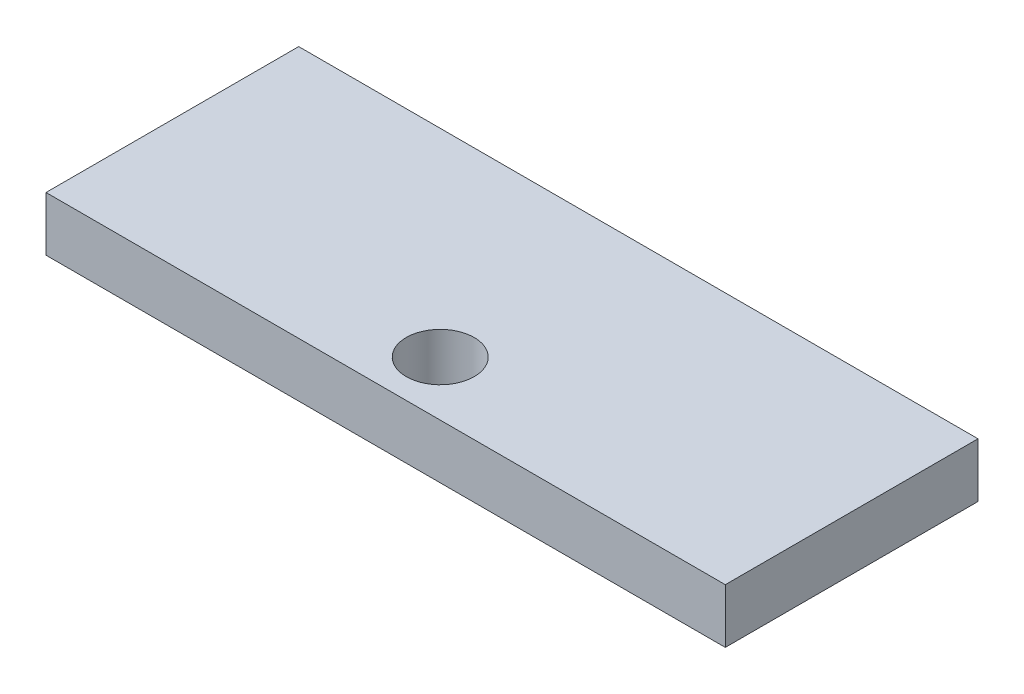
ISO-10303-21;
HEADER;
FILE_DESCRIPTION(('STEP AP214'),'2;1');
FILE_NAME('part.step','',(''),(''),'','','');
FILE_SCHEMA(('AUTOMOTIVE_DESIGN { 1 0 10303 214 1 1 1 1 }'));
ENDSEC;
DATA;
#1=APPLICATION_CONTEXT('core data for automotive mechanical design processes');
#2=APPLICATION_PROTOCOL_DEFINITION('international standard','automotive_design',2000,#1);
#3=PRODUCT_CONTEXT('',#1,'mechanical');
#4=PRODUCT('Part','Part','',(#3));
#5=PRODUCT_RELATED_PRODUCT_CATEGORY('part','',(#4));
#6=PRODUCT_DEFINITION_FORMATION('','',#4);
#7=PRODUCT_DEFINITION_CONTEXT('part definition',#1,'design');
#8=PRODUCT_DEFINITION('design','',#6,#7);
#9=PRODUCT_DEFINITION_SHAPE('','',#8);
#10=(LENGTH_UNIT() NAMED_UNIT(*) SI_UNIT(.MILLI.,.METRE.));
#11=(NAMED_UNIT(*) PLANE_ANGLE_UNIT() SI_UNIT($,.RADIAN.));
#12=(NAMED_UNIT(*) SI_UNIT($,.STERADIAN.) SOLID_ANGLE_UNIT());
#13=UNCERTAINTY_MEASURE_WITH_UNIT(LENGTH_MEASURE(1.E-05),#10,'distance_accuracy_value','');
#14=(GEOMETRIC_REPRESENTATION_CONTEXT(3) GLOBAL_UNCERTAINTY_ASSIGNED_CONTEXT((#13)) GLOBAL_UNIT_ASSIGNED_CONTEXT((#10,
#11,#12)) REPRESENTATION_CONTEXT('',''));
#15=CARTESIAN_POINT('',(0.,0.,0.));
#16=DIRECTION('',(0.,0.,1.));
#17=DIRECTION('',(1.,0.,0.));
#18=AXIS2_PLACEMENT_3D('',#15,#16,#17);
#19=CARTESIAN_POINT('',(0.,2.,0.));
#20=DIRECTION('',(0.,1.,0.));
#21=DIRECTION('',(0.,0.,1.));
#22=AXIS2_PLACEMENT_3D('',#19,#20,#21);
#23=PLANE('',#22);
#24=DIRECTION('',(0.,0.,-1.));
#25=VECTOR('',#24,1.);
#26=CARTESIAN_POINT('',(12.5,2.,4.75));
#27=LINE('',#26,#25);
#28=CARTESIAN_POINT('',(12.5,2.,4.75));
#29=VERTEX_POINT('',#28);
#30=CARTESIAN_POINT('',(12.5,2.,-4.55));
#31=VERTEX_POINT('',#30);
#32=EDGE_CURVE('E106',#29,#31,#27,.T.);
#33=ORIENTED_EDGE('',*,*,#32,.T.);
#34=DIRECTION('',(-1.,0.,0.));
#35=VECTOR('',#34,1.);
#36=CARTESIAN_POINT('',(-12.5,2.,-4.55));
#37=LINE('',#36,#35);
#38=CARTESIAN_POINT('',(-12.5,2.,-4.55));
#39=VERTEX_POINT('',#38);
#40=EDGE_CURVE('E11',#31,#39,#37,.T.);
#41=ORIENTED_EDGE('',*,*,#40,.T.);
#42=DIRECTION('',(0.,0.,1.));
#43=VECTOR('',#42,1.);
#44=CARTESIAN_POINT('',(-12.5,2.,4.75));
#45=LINE('',#44,#43);
#46=CARTESIAN_POINT('',(-12.5,2.,4.75));
#47=VERTEX_POINT('',#46);
#48=EDGE_CURVE('E88',#39,#47,#45,.T.);
#49=ORIENTED_EDGE('',*,*,#48,.T.);
#50=DIRECTION('',(1.,0.,0.));
#51=VECTOR('',#50,1.);
#52=CARTESIAN_POINT('',(12.5,2.,4.75));
#53=LINE('',#52,#51);
#54=EDGE_CURVE('E91',#47,#29,#53,.T.);
#55=ORIENTED_EDGE('',*,*,#54,.T.);
#56=EDGE_LOOP('',(#33,#41,#49,#55));
#57=FACE_BOUND('',#56,.T.);
#58=CARTESIAN_POINT('',(1.54390389361936E-13,2.,2.74151065336472));
#59=DIRECTION('',(0.,1.,0.));
#60=DIRECTION('',(0.,0.,1.));
#61=AXIS2_PLACEMENT_3D('',#58,#59,#60);
#62=CIRCLE('',#61,1.25);
#63=CARTESIAN_POINT('',(1.54390389361936E-13,2.,3.99151065336472));
#64=VERTEX_POINT('',#63);
#65=EDGE_CURVE('E142',#64,#64,#62,.T.);
#66=ORIENTED_EDGE('',*,*,#65,.F.);
#67=EDGE_LOOP('',(#66));
#68=FACE_BOUND('',#67,.T.);
#69=ADVANCED_FACE('F33',(#57,#68),#23,.T.);
#70=CARTESIAN_POINT('',(0.,0.,0.));
#71=DIRECTION('',(0.,1.,0.));
#72=DIRECTION('',(0.,0.,1.));
#73=AXIS2_PLACEMENT_3D('',#70,#71,#72);
#74=PLANE('',#73);
#75=DIRECTION('',(0.,0.,1.));
#76=VECTOR('',#75,1.);
#77=CARTESIAN_POINT('',(-12.5,0.,4.75));
#78=LINE('',#77,#76);
#79=CARTESIAN_POINT('',(-12.5,0.,-4.55));
#80=VERTEX_POINT('',#79);
#81=CARTESIAN_POINT('',(-12.5,0.,4.75));
#82=VERTEX_POINT('',#81);
#83=EDGE_CURVE('E109',#80,#82,#78,.T.);
#84=ORIENTED_EDGE('',*,*,#83,.F.);
#85=DIRECTION('',(1.,0.,0.));
#86=VECTOR('',#85,1.);
#87=CARTESIAN_POINT('',(0.,0.,-4.55));
#88=LINE('',#87,#86);
#89=CARTESIAN_POINT('',(12.5,0.,-4.55));
#90=VERTEX_POINT('',#89);
#91=EDGE_CURVE('E57',#80,#90,#88,.T.);
#92=ORIENTED_EDGE('',*,*,#91,.T.);
#93=DIRECTION('',(0.,0.,-1.));
#94=VECTOR('',#93,1.);
#95=CARTESIAN_POINT('',(12.5,0.,4.75));
#96=LINE('',#95,#94);
#97=CARTESIAN_POINT('',(12.5,0.,4.75));
#98=VERTEX_POINT('',#97);
#99=EDGE_CURVE('E98',#98,#90,#96,.T.);
#100=ORIENTED_EDGE('',*,*,#99,.F.);
#101=DIRECTION('',(1.,0.,0.));
#102=VECTOR('',#101,1.);
#103=CARTESIAN_POINT('',(12.5,0.,4.75));
#104=LINE('',#103,#102);
#105=EDGE_CURVE('E151',#82,#98,#104,.T.);
#106=ORIENTED_EDGE('',*,*,#105,.F.);
#107=EDGE_LOOP('',(#84,#92,#100,#106));
#108=FACE_BOUND('',#107,.T.);
#109=CARTESIAN_POINT('',(1.54390389361936E-13,0.,2.74151065336472));
#110=DIRECTION('',(0.,1.,0.));
#111=DIRECTION('',(0.,0.,1.));
#112=AXIS2_PLACEMENT_3D('',#109,#110,#111);
#113=CIRCLE('',#112,1.25);
#114=CARTESIAN_POINT('',(1.54390389361936E-13,0.,3.99151065336472));
#115=VERTEX_POINT('',#114);
#116=EDGE_CURVE('E137',#115,#115,#113,.T.);
#117=ORIENTED_EDGE('',*,*,#116,.T.);
#118=EDGE_LOOP('',(#117));
#119=FACE_BOUND('',#118,.T.);
#120=ADVANCED_FACE('F161',(#108,#119),#74,.F.);
#121=CARTESIAN_POINT('',(-12.5,2.,4.75));
#122=DIRECTION('',(1.,0.,0.));
#123=DIRECTION('',(0.,0.,-1.));
#124=AXIS2_PLACEMENT_3D('',#121,#122,#123);
#125=PLANE('',#124);
#126=ORIENTED_EDGE('',*,*,#48,.F.);
#127=DIRECTION('',(0.,-1.,0.));
#128=VECTOR('',#127,1.);
#129=CARTESIAN_POINT('',(-12.5,2.,-4.55));
#130=LINE('',#129,#128);
#131=EDGE_CURVE('E111',#39,#80,#130,.T.);
#132=ORIENTED_EDGE('',*,*,#131,.T.);
#133=ORIENTED_EDGE('',*,*,#83,.T.);
#134=DIRECTION('',(0.,-1.,0.));
#135=VECTOR('',#134,1.);
#136=CARTESIAN_POINT('',(-12.5,2.,4.75));
#137=LINE('',#136,#135);
#138=EDGE_CURVE('E103',#47,#82,#137,.T.);
#139=ORIENTED_EDGE('',*,*,#138,.F.);
#140=EDGE_LOOP('',(#126,#132,#133,#139));
#141=FACE_BOUND('',#140,.T.);
#142=ADVANCED_FACE('F108',(#141),#125,.F.);
#143=CARTESIAN_POINT('',(12.5,2.,4.75));
#144=DIRECTION('',(0.,0.,-1.));
#145=DIRECTION('',(-1.,0.,0.));
#146=AXIS2_PLACEMENT_3D('',#143,#144,#145);
#147=PLANE('',#146);
#148=ORIENTED_EDGE('',*,*,#105,.T.);
#149=DIRECTION('',(0.,-1.,0.));
#150=VECTOR('',#149,1.);
#151=CARTESIAN_POINT('',(12.5,2.,4.75));
#152=LINE('',#151,#150);
#153=EDGE_CURVE('E105',#29,#98,#152,.T.);
#154=ORIENTED_EDGE('',*,*,#153,.F.);
#155=ORIENTED_EDGE('',*,*,#54,.F.);
#156=ORIENTED_EDGE('',*,*,#138,.T.);
#157=EDGE_LOOP('',(#148,#154,#155,#156));
#158=FACE_BOUND('',#157,.T.);
#159=ADVANCED_FACE('F102',(#158),#147,.F.);
#160=CARTESIAN_POINT('',(12.5,2.,4.75));
#161=DIRECTION('',(-1.,0.,0.));
#162=DIRECTION('',(0.,0.,1.));
#163=AXIS2_PLACEMENT_3D('',#160,#161,#162);
#164=PLANE('',#163);
#165=ORIENTED_EDGE('',*,*,#99,.T.);
#166=DIRECTION('',(0.,1.,0.));
#167=VECTOR('',#166,1.);
#168=CARTESIAN_POINT('',(12.5,2.,-4.55));
#169=LINE('',#168,#167);
#170=EDGE_CURVE('E42',#90,#31,#169,.T.);
#171=ORIENTED_EDGE('',*,*,#170,.T.);
#172=ORIENTED_EDGE('',*,*,#32,.F.);
#173=ORIENTED_EDGE('',*,*,#153,.T.);
#174=EDGE_LOOP('',(#165,#171,#172,#173));
#175=FACE_BOUND('',#174,.T.);
#176=ADVANCED_FACE('F152',(#175),#164,.F.);
#177=CARTESIAN_POINT('',(12.5,2.,-4.75));
#178=DIRECTION('',(0.,0.,1.));
#179=DIRECTION('',(1.,0.,0.));
#180=AXIS2_PLACEMENT_3D('',#177,#178,#179);
#181=PLANE('',#180);
#182=DIRECTION('',(-1.,0.,0.));
#183=VECTOR('',#182,1.);
#184=CARTESIAN_POINT('',(12.5,0.199999999999999,-4.75));
#185=LINE('',#184,#183);
#186=CARTESIAN_POINT('',(12.3,0.199999999999999,-4.75));
#187=VERTEX_POINT('',#186);
#188=CARTESIAN_POINT('',(-12.3,0.199999999999999,-4.75));
#189=VERTEX_POINT('',#188);
#190=EDGE_CURVE('E121',#187,#189,#185,.T.);
#191=ORIENTED_EDGE('',*,*,#190,.T.);
#192=DIRECTION('',(0.,1.,0.));
#193=VECTOR('',#192,1.);
#194=CARTESIAN_POINT('',(-12.3,2.,-4.75));
#195=LINE('',#194,#193);
#196=CARTESIAN_POINT('',(-12.3,1.8,-4.75));
#197=VERTEX_POINT('',#196);
#198=EDGE_CURVE('E123',#189,#197,#195,.T.);
#199=ORIENTED_EDGE('',*,*,#198,.T.);
#200=DIRECTION('',(1.,0.,0.));
#201=VECTOR('',#200,1.);
#202=CARTESIAN_POINT('',(12.5,1.8,-4.75));
#203=LINE('',#202,#201);
#204=CARTESIAN_POINT('',(12.3,1.8,-4.75));
#205=VERTEX_POINT('',#204);
#206=EDGE_CURVE('E113',#197,#205,#203,.T.);
#207=ORIENTED_EDGE('',*,*,#206,.T.);
#208=DIRECTION('',(0.,-1.,0.));
#209=VECTOR('',#208,1.);
#210=CARTESIAN_POINT('',(12.3,2.,-4.75));
#211=LINE('',#210,#209);
#212=EDGE_CURVE('E119',#205,#187,#211,.T.);
#213=ORIENTED_EDGE('',*,*,#212,.T.);
#214=EDGE_LOOP('',(#191,#199,#207,#213));
#215=FACE_BOUND('',#214,.T.);
#216=ADVANCED_FACE('F172',(#215),#181,.F.);
#217=CARTESIAN_POINT('',(1.54390389361936E-13,2.,2.74151065336472));
#218=DIRECTION('',(0.,-1.,0.));
#219=DIRECTION('',(0.,0.,-1.));
#220=AXIS2_PLACEMENT_3D('',#217,#218,#219);
#221=CYLINDRICAL_SURFACE('',#220,1.25);
#222=ORIENTED_EDGE('',*,*,#65,.T.);
#223=EDGE_LOOP('',(#222));
#224=FACE_BOUND('',#223,.T.);
#225=ORIENTED_EDGE('',*,*,#116,.F.);
#226=EDGE_LOOP('',(#225));
#227=FACE_BOUND('',#226,.T.);
#228=ADVANCED_FACE('F175',(#224,#227),#221,.F.);
#229=CARTESIAN_POINT('',(12.3,2.,-4.75));
#230=DIRECTION('',(-0.707106781186548,0.,0.707106781186548));
#231=DIRECTION('',(0.,-1.,0.));
#232=AXIS2_PLACEMENT_3D('',#229,#230,#231);
#233=PLANE('',#232);
#234=DIRECTION('',(-0.577350269189626,0.577350269189626,-0.577350269189626));
#235=VECTOR('',#234,1.);
#236=CARTESIAN_POINT('',(11.7,0.799999999999999,-5.35));
#237=LINE('',#236,#235);
#238=EDGE_CURVE('E131',#187,#90,#237,.F.);
#239=ORIENTED_EDGE('',*,*,#238,.F.);
#240=ORIENTED_EDGE('',*,*,#212,.F.);
#241=DIRECTION('',(0.577350269189626,0.577350269189626,0.577350269189626));
#242=VECTOR('',#241,1.);
#243=CARTESIAN_POINT('',(8.33333333333333,-2.16666666666667,-8.71666666666667));
#244=LINE('',#243,#242);
#245=EDGE_CURVE('E37',#31,#205,#244,.F.);
#246=ORIENTED_EDGE('',*,*,#245,.F.);
#247=ORIENTED_EDGE('',*,*,#170,.F.);
#248=EDGE_LOOP('',(#239,#240,#246,#247));
#249=FACE_BOUND('',#248,.T.);
#250=ADVANCED_FACE('F35',(#249),#233,.F.);
#251=CARTESIAN_POINT('',(0.,2.,-4.55));
#252=DIRECTION('',(0.,0.707106781186548,-0.707106781186548));
#253=DIRECTION('',(1.,0.,0.));
#254=AXIS2_PLACEMENT_3D('',#251,#252,#253);
#255=PLANE('',#254);
#256=ORIENTED_EDGE('',*,*,#245,.T.);
#257=ORIENTED_EDGE('',*,*,#206,.F.);
#258=DIRECTION('',(0.577350269189626,-0.577350269189626,-0.577350269189626));
#259=VECTOR('',#258,1.);
#260=CARTESIAN_POINT('',(-8.33333333333333,-2.16666666666667,-8.71666666666667));
#261=LINE('',#260,#259);
#262=EDGE_CURVE('E130',#39,#197,#261,.T.);
#263=ORIENTED_EDGE('',*,*,#262,.F.);
#264=ORIENTED_EDGE('',*,*,#40,.F.);
#265=EDGE_LOOP('',(#256,#257,#263,#264));
#266=FACE_BOUND('',#265,.T.);
#267=ADVANCED_FACE('F155',(#266),#255,.T.);
#268=CARTESIAN_POINT('',(12.5,0.199999999999999,-4.75));
#269=DIRECTION('',(0.,0.707106781186548,0.707106781186548));
#270=DIRECTION('',(-1.,0.,0.));
#271=AXIS2_PLACEMENT_3D('',#268,#269,#270);
#272=PLANE('',#271);
#273=ORIENTED_EDGE('',*,*,#238,.T.);
#274=ORIENTED_EDGE('',*,*,#91,.F.);
#275=DIRECTION('',(0.577350269189626,0.577350269189626,-0.577350269189626));
#276=VECTOR('',#275,1.);
#277=CARTESIAN_POINT('',(-4.03333333333333,8.46666666666667,-13.0166666666667));
#278=LINE('',#277,#276);
#279=EDGE_CURVE('E128',#189,#80,#278,.F.);
#280=ORIENTED_EDGE('',*,*,#279,.F.);
#281=ORIENTED_EDGE('',*,*,#190,.F.);
#282=EDGE_LOOP('',(#273,#274,#280,#281));
#283=FACE_BOUND('',#282,.T.);
#284=ADVANCED_FACE('F183',(#283),#272,.F.);
#285=CARTESIAN_POINT('',(-12.5,2.,-4.55));
#286=DIRECTION('',(0.707106781186548,0.,0.707106781186548));
#287=DIRECTION('',(0.,-1.,0.));
#288=AXIS2_PLACEMENT_3D('',#285,#286,#287);
#289=PLANE('',#288);
#290=ORIENTED_EDGE('',*,*,#262,.T.);
#291=ORIENTED_EDGE('',*,*,#198,.F.);
#292=ORIENTED_EDGE('',*,*,#279,.T.);
#293=ORIENTED_EDGE('',*,*,#131,.F.);
#294=EDGE_LOOP('',(#290,#291,#292,#293));
#295=FACE_BOUND('',#294,.T.);
#296=ADVANCED_FACE('F159',(#295),#289,.F.);
#297=CLOSED_SHELL('',(#69,#120,#142,#159,#176,#216,#228,#250,#267,#284,#296));
#298=MANIFOLD_SOLID_BREP('B2',#297);
#299=ADVANCED_BREP_SHAPE_REPRESENTATION('',(#18,#298),#14);
#300=SHAPE_DEFINITION_REPRESENTATION(#9,#299);
ENDSEC;
END-ISO-10303-21;
